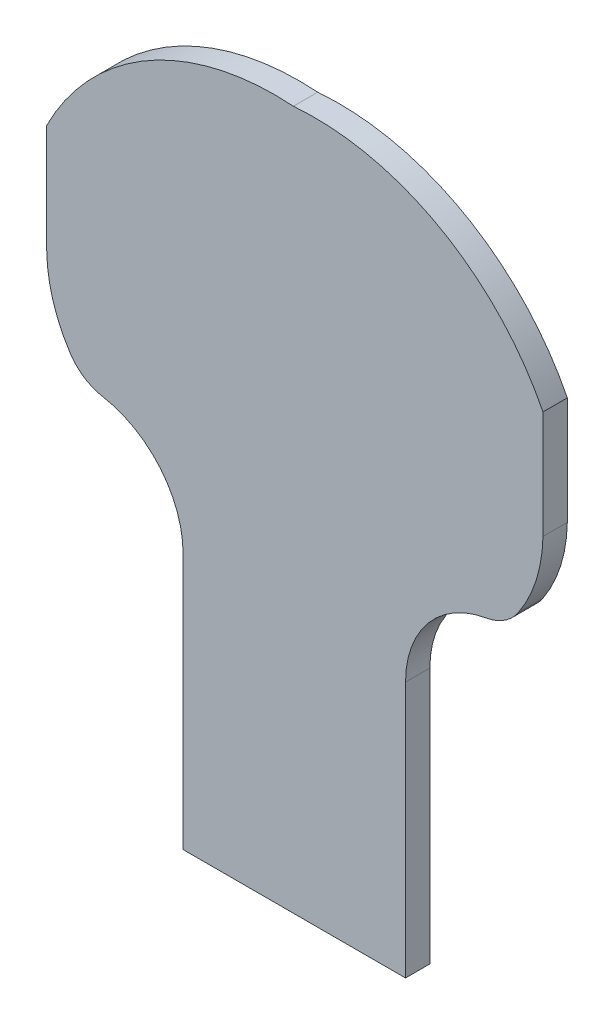
ISO-10303-21;
HEADER;
FILE_DESCRIPTION(('STEP AP214'),'2;1');
FILE_NAME('part.step','',(''),(''),'','','');
FILE_SCHEMA(('AUTOMOTIVE_DESIGN { 1 0 10303 214 1 1 1 1 }'));
ENDSEC;
DATA;
#1=APPLICATION_CONTEXT('core data for automotive mechanical design processes');
#2=APPLICATION_PROTOCOL_DEFINITION('international standard','automotive_design',2000,#1);
#3=PRODUCT_CONTEXT('',#1,'mechanical');
#4=PRODUCT('Part','Part','',(#3));
#5=PRODUCT_RELATED_PRODUCT_CATEGORY('part','',(#4));
#6=PRODUCT_DEFINITION_FORMATION('','',#4);
#7=PRODUCT_DEFINITION_CONTEXT('part definition',#1,'design');
#8=PRODUCT_DEFINITION('design','',#6,#7);
#9=PRODUCT_DEFINITION_SHAPE('','',#8);
#10=(LENGTH_UNIT() NAMED_UNIT(*) SI_UNIT(.MILLI.,.METRE.));
#11=(NAMED_UNIT(*) PLANE_ANGLE_UNIT() SI_UNIT($,.RADIAN.));
#12=(NAMED_UNIT(*) SI_UNIT($,.STERADIAN.) SOLID_ANGLE_UNIT());
#13=UNCERTAINTY_MEASURE_WITH_UNIT(LENGTH_MEASURE(1.E-05),#10,'distance_accuracy_value','');
#14=(GEOMETRIC_REPRESENTATION_CONTEXT(3) GLOBAL_UNCERTAINTY_ASSIGNED_CONTEXT((#13)) GLOBAL_UNIT_ASSIGNED_CONTEXT((#10,
#11,#12)) REPRESENTATION_CONTEXT('',''));
#15=CARTESIAN_POINT('',(0.,0.,0.));
#16=DIRECTION('',(0.,0.,1.));
#17=DIRECTION('',(1.,0.,0.));
#18=AXIS2_PLACEMENT_3D('',#15,#16,#17);
#19=CARTESIAN_POINT('',(-42.9108785051738,23.436424123527,5.));
#20=DIRECTION('',(0.,0.,-1.));
#21=DIRECTION('',(-1.,0.,0.));
#22=AXIS2_PLACEMENT_3D('',#19,#20,#21);
#23=CYLINDRICAL_SURFACE('',#22,20.);
#24=CARTESIAN_POINT('',(-42.9108785051738,23.436424123527,0.));
#25=DIRECTION('',(0.,0.,-1.));
#26=DIRECTION('',(1.,0.,0.));
#27=AXIS2_PLACEMENT_3D('',#24,#25,#26);
#28=CIRCLE('',#27,20.);
#29=CARTESIAN_POINT('',(-39.4660320410464,43.1375162972768,0.));
#30=VERTEX_POINT('',#29);
#31=CARTESIAN_POINT('',(-22.9108785051738,23.436424123527,0.));
#32=VERTEX_POINT('',#31);
#33=EDGE_CURVE('E158',#30,#32,#28,.T.);
#34=ORIENTED_EDGE('',*,*,#33,.T.);
#35=DIRECTION('',(0.,0.,-1.));
#36=VECTOR('',#35,1.);
#37=CARTESIAN_POINT('',(-22.9108785051738,23.436424123527,5.));
#38=LINE('',#37,#36);
#39=CARTESIAN_POINT('',(-22.9108785051738,23.436424123527,5.));
#40=VERTEX_POINT('',#39);
#41=EDGE_CURVE('E11',#40,#32,#38,.T.);
#42=ORIENTED_EDGE('',*,*,#41,.F.);
#43=CARTESIAN_POINT('',(-42.9108785051738,23.436424123527,5.));
#44=DIRECTION('',(0.,0.,-1.));
#45=DIRECTION('',(1.,0.,0.));
#46=AXIS2_PLACEMENT_3D('',#43,#44,#45);
#47=CIRCLE('',#46,20.);
#48=CARTESIAN_POINT('',(-39.4660320410464,43.1375162972768,5.));
#49=VERTEX_POINT('',#48);
#50=EDGE_CURVE('E182',#49,#40,#47,.T.);
#51=ORIENTED_EDGE('',*,*,#50,.F.);
#52=DIRECTION('',(0.,0.,-1.));
#53=VECTOR('',#52,1.);
#54=CARTESIAN_POINT('',(-39.4660320410464,43.1375162972768,5.));
#55=LINE('',#54,#53);
#56=EDGE_CURVE('E154',#49,#30,#55,.T.);
#57=ORIENTED_EDGE('',*,*,#56,.T.);
#58=EDGE_LOOP('',(#34,#42,#51,#57));
#59=FACE_BOUND('',#58,.T.);
#60=ADVANCED_FACE('F32',(#59),#23,.F.);
#61=CARTESIAN_POINT('',(-22.9108785051738,23.436424123527,5.));
#62=DIRECTION('',(1.,0.,0.));
#63=DIRECTION('',(0.,1.,0.));
#64=AXIS2_PLACEMENT_3D('',#61,#62,#63);
#65=PLANE('',#64);
#66=DIRECTION('',(0.,-1.,0.));
#67=VECTOR('',#66,1.);
#68=CARTESIAN_POINT('',(-22.9108785051738,23.436424123527,0.));
#69=LINE('',#68,#67);
#70=CARTESIAN_POINT('',(-22.9108785051738,-29.2323721223236,0.));
#71=VERTEX_POINT('',#70);
#72=EDGE_CURVE('E161',#32,#71,#69,.T.);
#73=ORIENTED_EDGE('',*,*,#72,.T.);
#74=DIRECTION('',(0.,0.,-1.));
#75=VECTOR('',#74,1.);
#76=CARTESIAN_POINT('',(-22.9108785051738,-29.2323721223236,5.));
#77=LINE('',#76,#75);
#78=CARTESIAN_POINT('',(-22.9108785051738,-29.2323721223236,5.));
#79=VERTEX_POINT('',#78);
#80=EDGE_CURVE('E40',#79,#71,#77,.T.);
#81=ORIENTED_EDGE('',*,*,#80,.F.);
#82=DIRECTION('',(0.,-1.,0.));
#83=VECTOR('',#82,1.);
#84=CARTESIAN_POINT('',(-22.9108785051738,23.436424123527,5.));
#85=LINE('',#84,#83);
#86=EDGE_CURVE('E106',#40,#79,#85,.T.);
#87=ORIENTED_EDGE('',*,*,#86,.F.);
#88=ORIENTED_EDGE('',*,*,#41,.T.);
#89=EDGE_LOOP('',(#73,#81,#87,#88));
#90=FACE_BOUND('',#89,.T.);
#91=ADVANCED_FACE('F265',(#90),#65,.F.);
#92=CARTESIAN_POINT('',(-22.9108785051738,-29.2323721223236,5.));
#93=DIRECTION('',(0.,1.,0.));
#94=DIRECTION('',(0.,0.,1.));
#95=AXIS2_PLACEMENT_3D('',#92,#93,#94);
#96=PLANE('',#95);
#97=DIRECTION('',(1.,0.,0.));
#98=VECTOR('',#97,1.);
#99=CARTESIAN_POINT('',(-22.9108785051738,-29.2323721223236,0.));
#100=LINE('',#99,#98);
#101=CARTESIAN_POINT('',(22.8016527411893,-29.2323721223236,0.));
#102=VERTEX_POINT('',#101);
#103=EDGE_CURVE('E163',#71,#102,#100,.T.);
#104=ORIENTED_EDGE('',*,*,#103,.T.);
#105=DIRECTION('',(0.,0.,-1.));
#106=VECTOR('',#105,1.);
#107=CARTESIAN_POINT('',(22.8016527411893,-29.2323721223236,5.));
#108=LINE('',#107,#106);
#109=CARTESIAN_POINT('',(22.8016527411893,-29.2323721223236,5.));
#110=VERTEX_POINT('',#109);
#111=EDGE_CURVE('E204',#110,#102,#108,.T.);
#112=ORIENTED_EDGE('',*,*,#111,.F.);
#113=DIRECTION('',(1.,0.,0.));
#114=VECTOR('',#113,1.);
#115=CARTESIAN_POINT('',(-22.9108785051738,-29.2323721223236,5.));
#116=LINE('',#115,#114);
#117=EDGE_CURVE('E212',#79,#110,#116,.T.);
#118=ORIENTED_EDGE('',*,*,#117,.F.);
#119=ORIENTED_EDGE('',*,*,#80,.T.);
#120=EDGE_LOOP('',(#104,#112,#118,#119));
#121=FACE_BOUND('',#120,.T.);
#122=ADVANCED_FACE('F210',(#121),#96,.F.);
#123=CARTESIAN_POINT('',(22.8016527411893,23.436424123527,5.));
#124=DIRECTION('',(-1.,0.,0.));
#125=DIRECTION('',(0.,-1.,0.));
#126=AXIS2_PLACEMENT_3D('',#123,#124,#125);
#127=PLANE('',#126);
#128=DIRECTION('',(0.,1.,0.));
#129=VECTOR('',#128,1.);
#130=CARTESIAN_POINT('',(22.8016527411893,23.436424123527,0.));
#131=LINE('',#130,#129);
#132=CARTESIAN_POINT('',(22.8016527411893,23.436424123527,0.));
#133=VERTEX_POINT('',#132);
#134=EDGE_CURVE('E165',#102,#133,#131,.T.);
#135=ORIENTED_EDGE('',*,*,#134,.T.);
#136=DIRECTION('',(0.,0.,-1.));
#137=VECTOR('',#136,1.);
#138=CARTESIAN_POINT('',(22.8016527411893,23.436424123527,5.));
#139=LINE('',#138,#137);
#140=CARTESIAN_POINT('',(22.8016527411893,23.436424123527,5.));
#141=VERTEX_POINT('',#140);
#142=EDGE_CURVE('E201',#141,#133,#139,.T.);
#143=ORIENTED_EDGE('',*,*,#142,.F.);
#144=DIRECTION('',(0.,1.,0.));
#145=VECTOR('',#144,1.);
#146=CARTESIAN_POINT('',(22.8016527411893,23.436424123527,5.));
#147=LINE('',#146,#145);
#148=EDGE_CURVE('E230',#110,#141,#147,.T.);
#149=ORIENTED_EDGE('',*,*,#148,.F.);
#150=ORIENTED_EDGE('',*,*,#111,.T.);
#151=EDGE_LOOP('',(#135,#143,#149,#150));
#152=FACE_BOUND('',#151,.T.);
#153=ADVANCED_FACE('F221',(#152),#127,.F.);
#154=CARTESIAN_POINT('',(42.8016527411894,23.436424123527,5.));
#155=DIRECTION('',(0.,0.,-1.));
#156=DIRECTION('',(-1.,0.,0.));
#157=AXIS2_PLACEMENT_3D('',#154,#155,#156);
#158=CYLINDRICAL_SURFACE('',#157,20.);
#159=CARTESIAN_POINT('',(42.8016527411894,23.436424123527,0.));
#160=DIRECTION('',(0.,0.,-1.));
#161=DIRECTION('',(1.,0.,0.));
#162=AXIS2_PLACEMENT_3D('',#159,#160,#161);
#163=CIRCLE('',#162,20.);
#164=CARTESIAN_POINT('',(39.4017543291883,43.145322895099,0.));
#165=VERTEX_POINT('',#164);
#166=EDGE_CURVE('E167',#133,#165,#163,.T.);
#167=ORIENTED_EDGE('',*,*,#166,.T.);
#168=DIRECTION('',(0.,0.,-1.));
#169=VECTOR('',#168,1.);
#170=CARTESIAN_POINT('',(39.4017543291883,43.145322895099,5.));
#171=LINE('',#170,#169);
#172=CARTESIAN_POINT('',(39.4017543291883,43.145322895099,5.));
#173=VERTEX_POINT('',#172);
#174=EDGE_CURVE('E198',#173,#165,#171,.T.);
#175=ORIENTED_EDGE('',*,*,#174,.F.);
#176=CARTESIAN_POINT('',(42.8016527411894,23.436424123527,5.));
#177=DIRECTION('',(0.,0.,-1.));
#178=DIRECTION('',(1.,0.,0.));
#179=AXIS2_PLACEMENT_3D('',#176,#177,#178);
#180=CIRCLE('',#179,20.);
#181=EDGE_CURVE('E227',#141,#173,#180,.T.);
#182=ORIENTED_EDGE('',*,*,#181,.F.);
#183=ORIENTED_EDGE('',*,*,#142,.T.);
#184=EDGE_LOOP('',(#167,#175,#182,#183));
#185=FACE_BOUND('',#184,.T.);
#186=ADVANCED_FACE('F225',(#185),#158,.F.);
#187=CARTESIAN_POINT('',(37.7018051231877,52.999772280885,5.));
#188=DIRECTION('',(0.,0.,-1.));
#189=DIRECTION('',(-1.,0.,0.));
#190=AXIS2_PLACEMENT_3D('',#187,#188,#189);
#191=CYLINDRICAL_SURFACE('',#190,10.);
#192=CARTESIAN_POINT('',(37.7018051231877,52.999772280885,0.));
#193=DIRECTION('',(0.,0.,1.));
#194=DIRECTION('',(-1.,0.,0.));
#195=AXIS2_PLACEMENT_3D('',#192,#193,#194);
#196=CIRCLE('',#195,10.);
#197=CARTESIAN_POINT('',(46.0057548138233,47.4280203539419,0.));
#198=VERTEX_POINT('',#197);
#199=EDGE_CURVE('E169',#165,#198,#196,.T.);
#200=ORIENTED_EDGE('',*,*,#199,.T.);
#201=DIRECTION('',(0.,0.,-1.));
#202=VECTOR('',#201,1.);
#203=CARTESIAN_POINT('',(46.0057548138233,47.4280203539419,5.));
#204=LINE('',#203,#202);
#205=CARTESIAN_POINT('',(46.0057548138233,47.4280203539419,5.));
#206=VERTEX_POINT('',#205);
#207=EDGE_CURVE('E195',#206,#198,#204,.T.);
#208=ORIENTED_EDGE('',*,*,#207,.F.);
#209=CARTESIAN_POINT('',(37.7018051231877,52.999772280885,5.));
#210=DIRECTION('',(0.,0.,1.));
#211=DIRECTION('',(-1.,0.,0.));
#212=AXIS2_PLACEMENT_3D('',#209,#210,#211);
#213=CIRCLE('',#212,10.);
#214=EDGE_CURVE('E229',#173,#206,#213,.T.);
#215=ORIENTED_EDGE('',*,*,#214,.F.);
#216=ORIENTED_EDGE('',*,*,#174,.T.);
#217=EDGE_LOOP('',(#200,#208,#215,#216));
#218=FACE_BOUND('',#217,.T.);
#219=ADVANCED_FACE('F278',(#218),#191,.T.);
#220=CARTESIAN_POINT('',(21.2789766474993,64.0190979770009,5.));
#221=DIRECTION('',(0.,0.,-1.));
#222=DIRECTION('',(-1.,0.,0.));
#223=AXIS2_PLACEMENT_3D('',#220,#221,#222);
#224=CYLINDRICAL_SURFACE('',#223,29.7771290621001);
#225=CARTESIAN_POINT('',(21.2789766474993,64.0190979770009,0.));
#226=DIRECTION('',(0.,0.,1.));
#227=DIRECTION('',(-1.,0.,0.));
#228=AXIS2_PLACEMENT_3D('',#225,#226,#227);
#229=CIRCLE('',#228,29.7771290621001);
#230=CARTESIAN_POINT('',(51.0512184071819,63.4796206521975,0.));
#231=VERTEX_POINT('',#230);
#232=EDGE_CURVE('E171',#198,#231,#229,.T.);
#233=ORIENTED_EDGE('',*,*,#232,.T.);
#234=DIRECTION('',(0.,0.,-1.));
#235=VECTOR('',#234,1.);
#236=CARTESIAN_POINT('',(51.0512184071819,63.4796206521975,5.));
#237=LINE('',#236,#235);
#238=CARTESIAN_POINT('',(51.0512184071819,63.4796206521975,5.));
#239=VERTEX_POINT('',#238);
#240=EDGE_CURVE('E192',#239,#231,#237,.T.);
#241=ORIENTED_EDGE('',*,*,#240,.F.);
#242=CARTESIAN_POINT('',(21.2789766474993,64.0190979770009,5.));
#243=DIRECTION('',(0.,0.,1.));
#244=DIRECTION('',(-1.,0.,0.));
#245=AXIS2_PLACEMENT_3D('',#242,#243,#244);
#246=CIRCLE('',#245,29.7771290621001);
#247=EDGE_CURVE('E232',#206,#239,#246,.T.);
#248=ORIENTED_EDGE('',*,*,#247,.F.);
#249=ORIENTED_EDGE('',*,*,#207,.T.);
#250=EDGE_LOOP('',(#233,#241,#248,#249));
#251=FACE_BOUND('',#250,.T.);
#252=ADVANCED_FACE('F281',(#251),#224,.T.);
#253=CARTESIAN_POINT('',(51.0512184071819,63.4796206521975,5.));
#254=DIRECTION('',(-1.,0.,0.));
#255=DIRECTION('',(0.,0.,1.));
#256=AXIS2_PLACEMENT_3D('',#253,#254,#255);
#257=PLANE('',#256);
#258=DIRECTION('',(0.,1.,0.));
#259=VECTOR('',#258,1.);
#260=CARTESIAN_POINT('',(51.0512184071819,63.4796206521975,0.));
#261=LINE('',#260,#259);
#262=CARTESIAN_POINT('',(51.0512184071819,85.6505780562106,0.));
#263=VERTEX_POINT('',#262);
#264=EDGE_CURVE('E173',#231,#263,#261,.T.);
#265=ORIENTED_EDGE('',*,*,#264,.T.);
#266=DIRECTION('',(0.,0.,-1.));
#267=VECTOR('',#266,1.);
#268=CARTESIAN_POINT('',(51.0512184071819,85.6505780562106,5.));
#269=LINE('',#268,#267);
#270=CARTESIAN_POINT('',(51.0512184071819,85.6505780562106,5.));
#271=VERTEX_POINT('',#270);
#272=EDGE_CURVE('E189',#271,#263,#269,.T.);
#273=ORIENTED_EDGE('',*,*,#272,.F.);
#274=DIRECTION('',(0.,1.,0.));
#275=VECTOR('',#274,1.);
#276=CARTESIAN_POINT('',(51.0512184071819,63.4796206521975,5.));
#277=LINE('',#276,#275);
#278=EDGE_CURVE('E238',#239,#271,#277,.T.);
#279=ORIENTED_EDGE('',*,*,#278,.F.);
#280=ORIENTED_EDGE('',*,*,#240,.T.);
#281=EDGE_LOOP('',(#265,#273,#279,#280));
#282=FACE_BOUND('',#281,.T.);
#283=ADVANCED_FACE('F285',(#282),#257,.F.);
#284=CARTESIAN_POINT('',(4.12289640577195,62.0727024191947,5.));
#285=DIRECTION('',(0.,0.,-1.));
#286=DIRECTION('',(-1.,0.,0.));
#287=AXIS2_PLACEMENT_3D('',#284,#285,#286);
#288=CYLINDRICAL_SURFACE('',#287,52.5184122515391);
#289=CARTESIAN_POINT('',(4.12289640577195,62.0727024191947,0.));
#290=DIRECTION('',(0.,0.,1.));
#291=DIRECTION('',(1.,0.,0.));
#292=AXIS2_PLACEMENT_3D('',#289,#290,#291);
#293=CIRCLE('',#292,52.5184122515391);
#294=CARTESIAN_POINT('',(-0.25317582285175,114.40848002183,0.));
#295=VERTEX_POINT('',#294);
#296=EDGE_CURVE('E175',#263,#295,#293,.T.);
#297=ORIENTED_EDGE('',*,*,#296,.T.);
#298=DIRECTION('',(0.,0.,-1.));
#299=VECTOR('',#298,1.);
#300=CARTESIAN_POINT('',(-0.25317582285175,114.40848002183,5.));
#301=LINE('',#300,#299);
#302=CARTESIAN_POINT('',(-0.25317582285175,114.40848002183,5.));
#303=VERTEX_POINT('',#302);
#304=EDGE_CURVE('E186',#303,#295,#301,.T.);
#305=ORIENTED_EDGE('',*,*,#304,.F.);
#306=CARTESIAN_POINT('',(4.12289640577195,62.0727024191947,5.));
#307=DIRECTION('',(0.,0.,1.));
#308=DIRECTION('',(1.,0.,0.));
#309=AXIS2_PLACEMENT_3D('',#306,#307,#308);
#310=CIRCLE('',#309,52.5184122515391);
#311=EDGE_CURVE('E240',#271,#303,#310,.T.);
#312=ORIENTED_EDGE('',*,*,#311,.F.);
#313=ORIENTED_EDGE('',*,*,#272,.T.);
#314=EDGE_LOOP('',(#297,#305,#312,#313));
#315=FACE_BOUND('',#314,.T.);
#316=ADVANCED_FACE('F246',(#315),#288,.T.);
#317=CARTESIAN_POINT('',(-4.04344019669043,62.0270183353742,5.));
#318=DIRECTION('',(0.,0.,-1.));
#319=DIRECTION('',(-1.,0.,0.));
#320=AXIS2_PLACEMENT_3D('',#317,#318,#319);
#321=CYLINDRICAL_SURFACE('',#320,52.5184123182832);
#322=CARTESIAN_POINT('',(-4.04344019669043,62.0270183353742,0.));
#323=DIRECTION('',(0.,0.,1.));
#324=DIRECTION('',(-1.,0.,0.));
#325=AXIS2_PLACEMENT_3D('',#322,#323,#324);
#326=CIRCLE('',#325,52.5184123182832);
#327=CARTESIAN_POINT('',(-50.9487815932211,85.6505782048797,0.));
#328=VERTEX_POINT('',#327);
#329=EDGE_CURVE('E177',#295,#328,#326,.T.);
#330=ORIENTED_EDGE('',*,*,#329,.T.);
#331=DIRECTION('',(0.,0.,-1.));
#332=VECTOR('',#331,1.);
#333=CARTESIAN_POINT('',(-50.9487815932211,85.6505782048797,5.));
#334=LINE('',#333,#332);
#335=CARTESIAN_POINT('',(-50.9487815932211,85.6505782048797,5.));
#336=VERTEX_POINT('',#335);
#337=EDGE_CURVE('E149',#336,#328,#334,.T.);
#338=ORIENTED_EDGE('',*,*,#337,.F.);
#339=CARTESIAN_POINT('',(-4.04344019669043,62.0270183353742,5.));
#340=DIRECTION('',(0.,0.,1.));
#341=DIRECTION('',(-1.,0.,0.));
#342=AXIS2_PLACEMENT_3D('',#339,#340,#341);
#343=CIRCLE('',#342,52.5184123182832);
#344=EDGE_CURVE('E140',#303,#336,#343,.T.);
#345=ORIENTED_EDGE('',*,*,#344,.F.);
#346=ORIENTED_EDGE('',*,*,#304,.T.);
#347=EDGE_LOOP('',(#330,#338,#345,#346));
#348=FACE_BOUND('',#347,.T.);
#349=ADVANCED_FACE('F250',(#348),#321,.T.);
#350=CARTESIAN_POINT('',(-50.9487815932211,85.6505782048797,5.));
#351=DIRECTION('',(1.,0.,0.));
#352=DIRECTION('',(0.,1.,0.));
#353=AXIS2_PLACEMENT_3D('',#350,#351,#352);
#354=PLANE('',#353);
#355=DIRECTION('',(0.,-1.,0.));
#356=VECTOR('',#355,1.);
#357=CARTESIAN_POINT('',(-50.9487815932211,85.6505782048797,0.));
#358=LINE('',#357,#356);
#359=CARTESIAN_POINT('',(-50.9487815932211,63.4796206521975,0.));
#360=VERTEX_POINT('',#359);
#361=EDGE_CURVE('E148',#328,#360,#358,.T.);
#362=ORIENTED_EDGE('',*,*,#361,.T.);
#363=DIRECTION('',(0.,0.,-1.));
#364=VECTOR('',#363,1.);
#365=CARTESIAN_POINT('',(-50.9487815932211,63.4796206521975,5.));
#366=LINE('',#365,#364);
#367=CARTESIAN_POINT('',(-50.9487815932211,63.4796206521975,5.));
#368=VERTEX_POINT('',#367);
#369=EDGE_CURVE('E145',#368,#360,#366,.T.);
#370=ORIENTED_EDGE('',*,*,#369,.F.);
#371=DIRECTION('',(0.,-1.,0.));
#372=VECTOR('',#371,1.);
#373=CARTESIAN_POINT('',(-50.9487815932211,85.6505782048797,5.));
#374=LINE('',#373,#372);
#375=EDGE_CURVE('E134',#336,#368,#374,.T.);
#376=ORIENTED_EDGE('',*,*,#375,.F.);
#377=ORIENTED_EDGE('',*,*,#337,.T.);
#378=EDGE_LOOP('',(#362,#370,#376,#377));
#379=FACE_BOUND('',#378,.T.);
#380=ADVANCED_FACE('F146',(#379),#354,.F.);
#381=CARTESIAN_POINT('',(-21.2780576335267,63.7524648306215,5.));
#382=DIRECTION('',(0.,0.,-1.));
#383=DIRECTION('',(-1.,0.,0.));
#384=AXIS2_PLACEMENT_3D('',#381,#382,#383);
#385=CYLINDRICAL_SURFACE('',#384,29.671978434848);
#386=CARTESIAN_POINT('',(-21.2780576335267,63.7524648306215,0.));
#387=DIRECTION('',(0.,0.,1.));
#388=DIRECTION('',(1.,0.,0.));
#389=AXIS2_PLACEMENT_3D('',#386,#387,#388);
#390=CIRCLE('',#389,29.671978434848);
#391=CARTESIAN_POINT('',(-46.1136622990212,47.5161153290447,0.));
#392=VERTEX_POINT('',#391);
#393=EDGE_CURVE('E92',#360,#392,#390,.T.);
#394=ORIENTED_EDGE('',*,*,#393,.T.);
#395=DIRECTION('',(0.,0.,-1.));
#396=VECTOR('',#395,1.);
#397=CARTESIAN_POINT('',(-46.1136622990212,47.5161153290447,5.));
#398=LINE('',#397,#396);
#399=CARTESIAN_POINT('',(-46.1136622990212,47.5161153290447,5.));
#400=VERTEX_POINT('',#399);
#401=EDGE_CURVE('E150',#400,#392,#398,.T.);
#402=ORIENTED_EDGE('',*,*,#401,.F.);
#403=CARTESIAN_POINT('',(-21.2780576335267,63.7524648306215,5.));
#404=DIRECTION('',(0.,0.,1.));
#405=DIRECTION('',(1.,0.,0.));
#406=AXIS2_PLACEMENT_3D('',#403,#404,#405);
#407=CIRCLE('',#406,29.671978434848);
#408=EDGE_CURVE('E138',#368,#400,#407,.T.);
#409=ORIENTED_EDGE('',*,*,#408,.F.);
#410=ORIENTED_EDGE('',*,*,#369,.T.);
#411=EDGE_LOOP('',(#394,#402,#409,#410));
#412=FACE_BOUND('',#411,.T.);
#413=ADVANCED_FACE('F152',(#412),#385,.T.);
#414=CARTESIAN_POINT('',(-37.7436088089827,52.9880623841518,5.));
#415=DIRECTION('',(0.,0.,-1.));
#416=DIRECTION('',(-1.,0.,0.));
#417=AXIS2_PLACEMENT_3D('',#414,#415,#416);
#418=CYLINDRICAL_SURFACE('',#417,10.);
#419=CARTESIAN_POINT('',(-37.7436088089827,52.9880623841518,0.));
#420=DIRECTION('',(0.,0.,1.));
#421=DIRECTION('',(-1.,0.,0.));
#422=AXIS2_PLACEMENT_3D('',#419,#420,#421);
#423=CIRCLE('',#422,10.);
#424=EDGE_CURVE('E98',#392,#30,#423,.T.);
#425=ORIENTED_EDGE('',*,*,#424,.T.);
#426=ORIENTED_EDGE('',*,*,#56,.F.);
#427=CARTESIAN_POINT('',(-37.7436088089827,52.9880623841518,5.));
#428=DIRECTION('',(0.,0.,1.));
#429=DIRECTION('',(-1.,0.,0.));
#430=AXIS2_PLACEMENT_3D('',#427,#428,#429);
#431=CIRCLE('',#430,10.);
#432=EDGE_CURVE('E48',#400,#49,#431,.T.);
#433=ORIENTED_EDGE('',*,*,#432,.F.);
#434=ORIENTED_EDGE('',*,*,#401,.T.);
#435=EDGE_LOOP('',(#425,#426,#433,#434));
#436=FACE_BOUND('',#435,.T.);
#437=ADVANCED_FACE('F254',(#436),#418,.T.);
#438=CARTESIAN_POINT('',(-42.9108785051738,23.436424123527,5.));
#439=DIRECTION('',(0.,0.,1.));
#440=DIRECTION('',(1.,0.,0.));
#441=AXIS2_PLACEMENT_3D('',#438,#439,#440);
#442=PLANE('',#441);
#443=ORIENTED_EDGE('',*,*,#50,.T.);
#444=ORIENTED_EDGE('',*,*,#86,.T.);
#445=ORIENTED_EDGE('',*,*,#117,.T.);
#446=ORIENTED_EDGE('',*,*,#148,.T.);
#447=ORIENTED_EDGE('',*,*,#181,.T.);
#448=ORIENTED_EDGE('',*,*,#214,.T.);
#449=ORIENTED_EDGE('',*,*,#247,.T.);
#450=ORIENTED_EDGE('',*,*,#278,.T.);
#451=ORIENTED_EDGE('',*,*,#311,.T.);
#452=ORIENTED_EDGE('',*,*,#344,.T.);
#453=ORIENTED_EDGE('',*,*,#375,.T.);
#454=ORIENTED_EDGE('',*,*,#408,.T.);
#455=ORIENTED_EDGE('',*,*,#432,.T.);
#456=EDGE_LOOP('',(#443,#444,#445,#446,#447,#448,#449,#450,#451,#452,#453,#454,#455));
#457=FACE_BOUND('',#456,.T.);
#458=ADVANCED_FACE('F136',(#457),#442,.T.);
#459=CARTESIAN_POINT('',(-42.9108785051738,23.436424123527,0.));
#460=DIRECTION('',(0.,0.,1.));
#461=DIRECTION('',(1.,0.,0.));
#462=AXIS2_PLACEMENT_3D('',#459,#460,#461);
#463=PLANE('',#462);
#464=ORIENTED_EDGE('',*,*,#33,.F.);
#465=ORIENTED_EDGE('',*,*,#424,.F.);
#466=ORIENTED_EDGE('',*,*,#393,.F.);
#467=ORIENTED_EDGE('',*,*,#361,.F.);
#468=ORIENTED_EDGE('',*,*,#329,.F.);
#469=ORIENTED_EDGE('',*,*,#296,.F.);
#470=ORIENTED_EDGE('',*,*,#264,.F.);
#471=ORIENTED_EDGE('',*,*,#232,.F.);
#472=ORIENTED_EDGE('',*,*,#199,.F.);
#473=ORIENTED_EDGE('',*,*,#166,.F.);
#474=ORIENTED_EDGE('',*,*,#134,.F.);
#475=ORIENTED_EDGE('',*,*,#103,.F.);
#476=ORIENTED_EDGE('',*,*,#72,.F.);
#477=EDGE_LOOP('',(#464,#465,#466,#467,#468,#469,#470,#471,#472,#473,#474,#475,#476));
#478=FACE_BOUND('',#477,.T.);
#479=ADVANCED_FACE('F216',(#478),#463,.F.);
#480=CLOSED_SHELL('',(#60,#91,#122,#153,#186,#219,#252,#283,#316,#349,#380,#413,#437,#458,#479));
#481=MANIFOLD_SOLID_BREP('B2',#480);
#482=ADVANCED_BREP_SHAPE_REPRESENTATION('',(#18,#481),#14);
#483=SHAPE_DEFINITION_REPRESENTATION(#9,#482);
ENDSEC;
END-ISO-10303-21;
